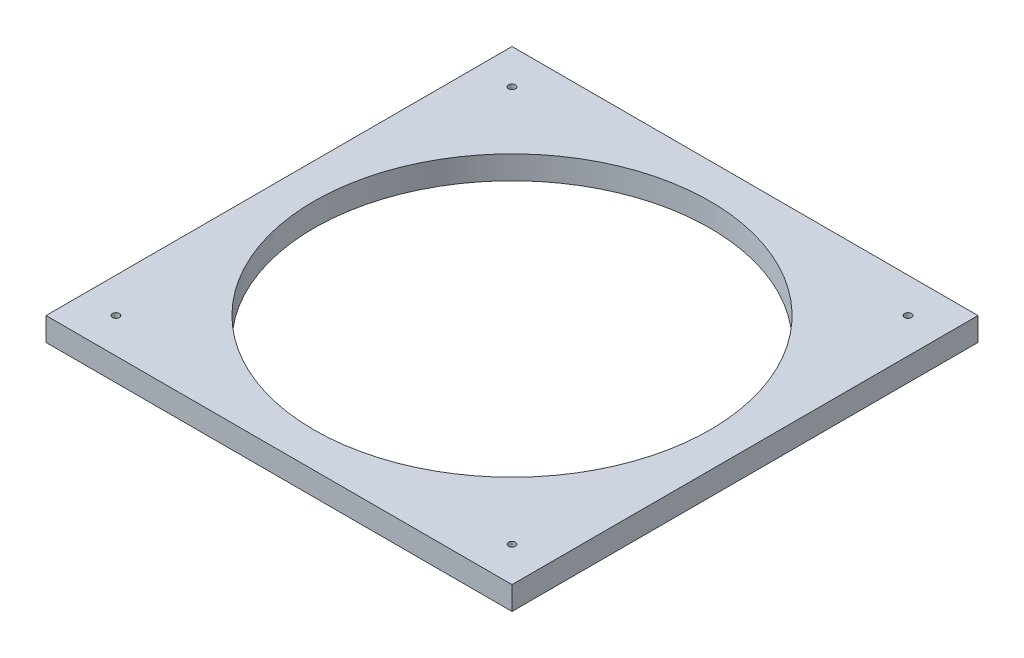
ISO-10303-21;
HEADER;
FILE_DESCRIPTION(('STEP AP214'),'2;1');
FILE_NAME('part.step','',(''),(''),'','','');
FILE_SCHEMA(('AUTOMOTIVE_DESIGN { 1 0 10303 214 1 1 1 1 }'));
ENDSEC;
DATA;
#1=APPLICATION_CONTEXT('core data for automotive mechanical design processes');
#2=APPLICATION_PROTOCOL_DEFINITION('international standard','automotive_design',2000,#1);
#3=PRODUCT_CONTEXT('',#1,'mechanical');
#4=PRODUCT('Part','Part','',(#3));
#5=PRODUCT_RELATED_PRODUCT_CATEGORY('part','',(#4));
#6=PRODUCT_DEFINITION_FORMATION('','',#4);
#7=PRODUCT_DEFINITION_CONTEXT('part definition',#1,'design');
#8=PRODUCT_DEFINITION('design','',#6,#7);
#9=PRODUCT_DEFINITION_SHAPE('','',#8);
#10=(LENGTH_UNIT() NAMED_UNIT(*) SI_UNIT(.MILLI.,.METRE.));
#11=(NAMED_UNIT(*) PLANE_ANGLE_UNIT() SI_UNIT($,.RADIAN.));
#12=(NAMED_UNIT(*) SI_UNIT($,.STERADIAN.) SOLID_ANGLE_UNIT());
#13=UNCERTAINTY_MEASURE_WITH_UNIT(LENGTH_MEASURE(1.E-05),#10,'distance_accuracy_value','');
#14=(GEOMETRIC_REPRESENTATION_CONTEXT(3) GLOBAL_UNCERTAINTY_ASSIGNED_CONTEXT((#13)) GLOBAL_UNIT_ASSIGNED_CONTEXT((#10,
#11,#12)) REPRESENTATION_CONTEXT('',''));
#15=CARTESIAN_POINT('',(0.,0.,0.));
#16=DIRECTION('',(0.,0.,1.));
#17=DIRECTION('',(1.,0.,0.));
#18=AXIS2_PLACEMENT_3D('',#15,#16,#17);
#19=CARTESIAN_POINT('',(0.,20.,0.));
#20=DIRECTION('',(0.,1.,0.));
#21=DIRECTION('',(0.,0.,1.));
#22=AXIS2_PLACEMENT_3D('',#19,#20,#21);
#23=PLANE('',#22);
#24=CARTESIAN_POINT('',(170.00000000001,20.,169.99999999999));
#25=DIRECTION('',(0.,1.,0.));
#26=DIRECTION('',(0.,0.,1.));
#27=AXIS2_PLACEMENT_3D('',#24,#25,#26);
#28=CIRCLE('',#27,2.99999999999999);
#29=CARTESIAN_POINT('',(170.00000000001,20.,172.99999999999));
#30=VERTEX_POINT('',#29);
#31=EDGE_CURVE('E127',#30,#30,#28,.T.);
#32=ORIENTED_EDGE('',*,*,#31,.F.);
#33=EDGE_LOOP('',(#32));
#34=FACE_BOUND('',#33,.T.);
#35=CARTESIAN_POINT('',(-170.,20.,-170.));
#36=DIRECTION('',(0.,1.,0.));
#37=DIRECTION('',(0.,0.,1.));
#38=AXIS2_PLACEMENT_3D('',#35,#36,#37);
#39=CIRCLE('',#38,2.99999999999999);
#40=CARTESIAN_POINT('',(-170.,20.,-167.));
#41=VERTEX_POINT('',#40);
#42=EDGE_CURVE('E115',#41,#41,#39,.T.);
#43=ORIENTED_EDGE('',*,*,#42,.F.);
#44=EDGE_LOOP('',(#43));
#45=FACE_BOUND('',#44,.T.);
#46=DIRECTION('',(0.,0.,1.));
#47=VECTOR('',#46,1.);
#48=CARTESIAN_POINT('',(-200.,20.,-200.));
#49=LINE('',#48,#47);
#50=CARTESIAN_POINT('',(-200.,20.,-200.));
#51=VERTEX_POINT('',#50);
#52=CARTESIAN_POINT('',(-200.,20.,200.));
#53=VERTEX_POINT('',#52);
#54=EDGE_CURVE('E85',#51,#53,#49,.T.);
#55=ORIENTED_EDGE('',*,*,#54,.T.);
#56=DIRECTION('',(1.,0.,0.));
#57=VECTOR('',#56,1.);
#58=CARTESIAN_POINT('',(-200.,20.,200.));
#59=LINE('',#58,#57);
#60=CARTESIAN_POINT('',(200.,20.,200.));
#61=VERTEX_POINT('',#60);
#62=EDGE_CURVE('E80',#53,#61,#59,.T.);
#63=ORIENTED_EDGE('',*,*,#62,.T.);
#64=DIRECTION('',(0.,0.,-1.));
#65=VECTOR('',#64,1.);
#66=CARTESIAN_POINT('',(200.,20.,-200.));
#67=LINE('',#66,#65);
#68=CARTESIAN_POINT('',(200.,20.,-200.));
#69=VERTEX_POINT('',#68);
#70=EDGE_CURVE('E83',#61,#69,#67,.T.);
#71=ORIENTED_EDGE('',*,*,#70,.T.);
#72=DIRECTION('',(-1.,0.,0.));
#73=VECTOR('',#72,1.);
#74=CARTESIAN_POINT('',(-200.,20.,-200.));
#75=LINE('',#74,#73);
#76=EDGE_CURVE('E50',#69,#51,#75,.T.);
#77=ORIENTED_EDGE('',*,*,#76,.T.);
#78=EDGE_LOOP('',(#55,#63,#71,#77));
#79=FACE_BOUND('',#78,.T.);
#80=CARTESIAN_POINT('',(0.,20.,0.));
#81=DIRECTION('',(0.,1.,0.));
#82=DIRECTION('',(0.,0.,1.));
#83=AXIS2_PLACEMENT_3D('',#80,#81,#82);
#84=CIRCLE('',#83,170.);
#85=CARTESIAN_POINT('',(0.,20.,170.));
#86=VERTEX_POINT('',#85);
#87=EDGE_CURVE('E100',#86,#86,#84,.T.);
#88=ORIENTED_EDGE('',*,*,#87,.F.);
#89=EDGE_LOOP('',(#88));
#90=FACE_BOUND('',#89,.T.);
#91=CARTESIAN_POINT('',(170.,20.,-170.00000000001));
#92=DIRECTION('',(0.,1.,0.));
#93=DIRECTION('',(0.,0.,1.));
#94=AXIS2_PLACEMENT_3D('',#91,#92,#93);
#95=CIRCLE('',#94,2.99999999999999);
#96=CARTESIAN_POINT('',(170.,20.,-167.00000000001));
#97=VERTEX_POINT('',#96);
#98=EDGE_CURVE('E121',#97,#97,#95,.T.);
#99=ORIENTED_EDGE('',*,*,#98,.F.);
#100=EDGE_LOOP('',(#99));
#101=FACE_BOUND('',#100,.T.);
#102=CARTESIAN_POINT('',(-169.99999999999,20.,170.));
#103=DIRECTION('',(0.,1.,0.));
#104=DIRECTION('',(0.,0.,1.));
#105=AXIS2_PLACEMENT_3D('',#102,#103,#104);
#106=CIRCLE('',#105,2.99999999999999);
#107=CARTESIAN_POINT('',(-169.99999999999,20.,173.));
#108=VERTEX_POINT('',#107);
#109=EDGE_CURVE('E133',#108,#108,#106,.T.);
#110=ORIENTED_EDGE('',*,*,#109,.F.);
#111=EDGE_LOOP('',(#110));
#112=FACE_BOUND('',#111,.T.);
#113=ADVANCED_FACE('F33',(#34,#45,#79,#90,#101,#112),#23,.T.);
#114=CARTESIAN_POINT('',(0.,0.,0.));
#115=DIRECTION('',(0.,1.,0.));
#116=DIRECTION('',(0.,0.,1.));
#117=AXIS2_PLACEMENT_3D('',#114,#115,#116);
#118=PLANE('',#117);
#119=DIRECTION('',(0.,0.,1.));
#120=VECTOR('',#119,1.);
#121=CARTESIAN_POINT('',(-200.,0.,-200.));
#122=LINE('',#121,#120);
#123=CARTESIAN_POINT('',(-200.,0.,-200.));
#124=VERTEX_POINT('',#123);
#125=CARTESIAN_POINT('',(-200.,0.,200.));
#126=VERTEX_POINT('',#125);
#127=EDGE_CURVE('E97',#124,#126,#122,.T.);
#128=ORIENTED_EDGE('',*,*,#127,.F.);
#129=DIRECTION('',(-1.,0.,0.));
#130=VECTOR('',#129,1.);
#131=CARTESIAN_POINT('',(-200.,0.,-200.));
#132=LINE('',#131,#130);
#133=CARTESIAN_POINT('',(200.,0.,-200.));
#134=VERTEX_POINT('',#133);
#135=EDGE_CURVE('E73',#134,#124,#132,.T.);
#136=ORIENTED_EDGE('',*,*,#135,.F.);
#137=DIRECTION('',(0.,0.,-1.));
#138=VECTOR('',#137,1.);
#139=CARTESIAN_POINT('',(200.,0.,-200.));
#140=LINE('',#139,#138);
#141=CARTESIAN_POINT('',(200.,0.,200.));
#142=VERTEX_POINT('',#141);
#143=EDGE_CURVE('E67',#142,#134,#140,.T.);
#144=ORIENTED_EDGE('',*,*,#143,.F.);
#145=DIRECTION('',(1.,0.,0.));
#146=VECTOR('',#145,1.);
#147=CARTESIAN_POINT('',(-200.,0.,200.));
#148=LINE('',#147,#146);
#149=EDGE_CURVE('E89',#126,#142,#148,.T.);
#150=ORIENTED_EDGE('',*,*,#149,.F.);
#151=EDGE_LOOP('',(#128,#136,#144,#150));
#152=FACE_BOUND('',#151,.T.);
#153=CARTESIAN_POINT('',(0.,0.,0.));
#154=DIRECTION('',(0.,1.,0.));
#155=DIRECTION('',(0.,0.,1.));
#156=AXIS2_PLACEMENT_3D('',#153,#154,#155);
#157=CIRCLE('',#156,170.);
#158=CARTESIAN_POINT('',(0.,0.,170.));
#159=VERTEX_POINT('',#158);
#160=EDGE_CURVE('E112',#159,#159,#157,.T.);
#161=ORIENTED_EDGE('',*,*,#160,.T.);
#162=EDGE_LOOP('',(#161));
#163=FACE_BOUND('',#162,.T.);
#164=CARTESIAN_POINT('',(-170.,0.,-170.));
#165=DIRECTION('',(0.,1.,0.));
#166=DIRECTION('',(0.,0.,1.));
#167=AXIS2_PLACEMENT_3D('',#164,#165,#166);
#168=CIRCLE('',#167,2.99999999999999);
#169=CARTESIAN_POINT('',(-170.,0.,-167.));
#170=VERTEX_POINT('',#169);
#171=EDGE_CURVE('E118',#170,#170,#168,.T.);
#172=ORIENTED_EDGE('',*,*,#171,.T.);
#173=EDGE_LOOP('',(#172));
#174=FACE_BOUND('',#173,.T.);
#175=CARTESIAN_POINT('',(170.,0.,-170.00000000001));
#176=DIRECTION('',(0.,1.,0.));
#177=DIRECTION('',(0.,0.,1.));
#178=AXIS2_PLACEMENT_3D('',#175,#176,#177);
#179=CIRCLE('',#178,2.99999999999999);
#180=CARTESIAN_POINT('',(170.,0.,-167.00000000001));
#181=VERTEX_POINT('',#180);
#182=EDGE_CURVE('E124',#181,#181,#179,.T.);
#183=ORIENTED_EDGE('',*,*,#182,.T.);
#184=EDGE_LOOP('',(#183));
#185=FACE_BOUND('',#184,.T.);
#186=CARTESIAN_POINT('',(170.00000000001,0.,169.99999999999));
#187=DIRECTION('',(0.,1.,0.));
#188=DIRECTION('',(0.,0.,1.));
#189=AXIS2_PLACEMENT_3D('',#186,#187,#188);
#190=CIRCLE('',#189,2.99999999999999);
#191=CARTESIAN_POINT('',(170.00000000001,0.,172.99999999999));
#192=VERTEX_POINT('',#191);
#193=EDGE_CURVE('E130',#192,#192,#190,.T.);
#194=ORIENTED_EDGE('',*,*,#193,.T.);
#195=EDGE_LOOP('',(#194));
#196=FACE_BOUND('',#195,.T.);
#197=CARTESIAN_POINT('',(-169.99999999999,0.,170.));
#198=DIRECTION('',(0.,1.,0.));
#199=DIRECTION('',(0.,0.,1.));
#200=AXIS2_PLACEMENT_3D('',#197,#198,#199);
#201=CIRCLE('',#200,2.99999999999999);
#202=CARTESIAN_POINT('',(-169.99999999999,0.,173.));
#203=VERTEX_POINT('',#202);
#204=EDGE_CURVE('E136',#203,#203,#201,.T.);
#205=ORIENTED_EDGE('',*,*,#204,.T.);
#206=EDGE_LOOP('',(#205));
#207=FACE_BOUND('',#206,.T.);
#208=ADVANCED_FACE('F108',(#152,#163,#174,#185,#196,#207),#118,.F.);
#209=CARTESIAN_POINT('',(-200.,20.,-200.));
#210=DIRECTION('',(1.,0.,0.));
#211=DIRECTION('',(0.,0.,-1.));
#212=AXIS2_PLACEMENT_3D('',#209,#210,#211);
#213=PLANE('',#212);
#214=ORIENTED_EDGE('',*,*,#127,.T.);
#215=DIRECTION('',(0.,-1.,0.));
#216=VECTOR('',#215,1.);
#217=CARTESIAN_POINT('',(-200.,20.,200.));
#218=LINE('',#217,#216);
#219=EDGE_CURVE('E11',#53,#126,#218,.T.);
#220=ORIENTED_EDGE('',*,*,#219,.F.);
#221=ORIENTED_EDGE('',*,*,#54,.F.);
#222=DIRECTION('',(0.,-1.,0.));
#223=VECTOR('',#222,1.);
#224=CARTESIAN_POINT('',(-200.,20.,-200.));
#225=LINE('',#224,#223);
#226=EDGE_CURVE('E93',#51,#124,#225,.T.);
#227=ORIENTED_EDGE('',*,*,#226,.T.);
#228=EDGE_LOOP('',(#214,#220,#221,#227));
#229=FACE_BOUND('',#228,.T.);
#230=ADVANCED_FACE('F35',(#229),#213,.F.);
#231=CARTESIAN_POINT('',(-200.,20.,200.));
#232=DIRECTION('',(0.,0.,-1.));
#233=DIRECTION('',(-1.,0.,0.));
#234=AXIS2_PLACEMENT_3D('',#231,#232,#233);
#235=PLANE('',#234);
#236=ORIENTED_EDGE('',*,*,#149,.T.);
#237=DIRECTION('',(0.,-1.,0.));
#238=VECTOR('',#237,1.);
#239=CARTESIAN_POINT('',(200.,20.,200.));
#240=LINE('',#239,#238);
#241=EDGE_CURVE('E42',#61,#142,#240,.T.);
#242=ORIENTED_EDGE('',*,*,#241,.F.);
#243=ORIENTED_EDGE('',*,*,#62,.F.);
#244=ORIENTED_EDGE('',*,*,#219,.T.);
#245=EDGE_LOOP('',(#236,#242,#243,#244));
#246=FACE_BOUND('',#245,.T.);
#247=ADVANCED_FACE('F88',(#246),#235,.F.);
#248=CARTESIAN_POINT('',(200.,20.,-200.));
#249=DIRECTION('',(-1.,0.,0.));
#250=DIRECTION('',(0.,0.,1.));
#251=AXIS2_PLACEMENT_3D('',#248,#249,#250);
#252=PLANE('',#251);
#253=ORIENTED_EDGE('',*,*,#143,.T.);
#254=DIRECTION('',(0.,-1.,0.));
#255=VECTOR('',#254,1.);
#256=CARTESIAN_POINT('',(200.,20.,-200.));
#257=LINE('',#256,#255);
#258=EDGE_CURVE('E90',#69,#134,#257,.T.);
#259=ORIENTED_EDGE('',*,*,#258,.F.);
#260=ORIENTED_EDGE('',*,*,#70,.F.);
#261=ORIENTED_EDGE('',*,*,#241,.T.);
#262=EDGE_LOOP('',(#253,#259,#260,#261));
#263=FACE_BOUND('',#262,.T.);
#264=ADVANCED_FACE('F91',(#263),#252,.F.);
#265=CARTESIAN_POINT('',(-200.,20.,-200.));
#266=DIRECTION('',(0.,0.,1.));
#267=DIRECTION('',(1.,0.,0.));
#268=AXIS2_PLACEMENT_3D('',#265,#266,#267);
#269=PLANE('',#268);
#270=ORIENTED_EDGE('',*,*,#135,.T.);
#271=ORIENTED_EDGE('',*,*,#226,.F.);
#272=ORIENTED_EDGE('',*,*,#76,.F.);
#273=ORIENTED_EDGE('',*,*,#258,.T.);
#274=EDGE_LOOP('',(#270,#271,#272,#273));
#275=FACE_BOUND('',#274,.T.);
#276=ADVANCED_FACE('F105',(#275),#269,.F.);
#277=CARTESIAN_POINT('',(0.,20.,0.));
#278=DIRECTION('',(0.,-1.,0.));
#279=DIRECTION('',(0.,0.,-1.));
#280=AXIS2_PLACEMENT_3D('',#277,#278,#279);
#281=CYLINDRICAL_SURFACE('',#280,170.);
#282=ORIENTED_EDGE('',*,*,#87,.T.);
#283=EDGE_LOOP('',(#282));
#284=FACE_BOUND('',#283,.T.);
#285=ORIENTED_EDGE('',*,*,#160,.F.);
#286=EDGE_LOOP('',(#285));
#287=FACE_BOUND('',#286,.T.);
#288=ADVANCED_FACE('F155',(#284,#287),#281,.F.);
#289=CARTESIAN_POINT('',(-170.,20.,-170.));
#290=DIRECTION('',(0.,-1.,0.));
#291=DIRECTION('',(0.,0.,-1.));
#292=AXIS2_PLACEMENT_3D('',#289,#290,#291);
#293=CYLINDRICAL_SURFACE('',#292,2.99999999999999);
#294=ORIENTED_EDGE('',*,*,#42,.T.);
#295=EDGE_LOOP('',(#294));
#296=FACE_BOUND('',#295,.T.);
#297=ORIENTED_EDGE('',*,*,#171,.F.);
#298=EDGE_LOOP('',(#297));
#299=FACE_BOUND('',#298,.T.);
#300=ADVANCED_FACE('F201',(#296,#299),#293,.F.);
#301=CARTESIAN_POINT('',(170.,20.,-170.00000000001));
#302=DIRECTION('',(0.,-1.,0.));
#303=DIRECTION('',(0.,0.,-1.));
#304=AXIS2_PLACEMENT_3D('',#301,#302,#303);
#305=CYLINDRICAL_SURFACE('',#304,2.99999999999999);
#306=ORIENTED_EDGE('',*,*,#98,.T.);
#307=EDGE_LOOP('',(#306));
#308=FACE_BOUND('',#307,.T.);
#309=ORIENTED_EDGE('',*,*,#182,.F.);
#310=EDGE_LOOP('',(#309));
#311=FACE_BOUND('',#310,.T.);
#312=ADVANCED_FACE('F209',(#308,#311),#305,.F.);
#313=CARTESIAN_POINT('',(170.00000000001,20.,169.99999999999));
#314=DIRECTION('',(0.,-1.,0.));
#315=DIRECTION('',(0.,0.,-1.));
#316=AXIS2_PLACEMENT_3D('',#313,#314,#315);
#317=CYLINDRICAL_SURFACE('',#316,2.99999999999999);
#318=ORIENTED_EDGE('',*,*,#31,.T.);
#319=EDGE_LOOP('',(#318));
#320=FACE_BOUND('',#319,.T.);
#321=ORIENTED_EDGE('',*,*,#193,.F.);
#322=EDGE_LOOP('',(#321));
#323=FACE_BOUND('',#322,.T.);
#324=ADVANCED_FACE('F217',(#320,#323),#317,.F.);
#325=CARTESIAN_POINT('',(-169.99999999999,20.,170.));
#326=DIRECTION('',(0.,-1.,0.));
#327=DIRECTION('',(0.,0.,-1.));
#328=AXIS2_PLACEMENT_3D('',#325,#326,#327);
#329=CYLINDRICAL_SURFACE('',#328,2.99999999999999);
#330=ORIENTED_EDGE('',*,*,#109,.T.);
#331=EDGE_LOOP('',(#330));
#332=FACE_BOUND('',#331,.T.);
#333=ORIENTED_EDGE('',*,*,#204,.F.);
#334=EDGE_LOOP('',(#333));
#335=FACE_BOUND('',#334,.T.);
#336=ADVANCED_FACE('F142',(#332,#335),#329,.F.);
#337=CLOSED_SHELL('',(#113,#208,#230,#247,#264,#276,#288,#300,#312,#324,#336));
#338=MANIFOLD_SOLID_BREP('B2',#337);
#339=ADVANCED_BREP_SHAPE_REPRESENTATION('',(#18,#338),#14);
#340=SHAPE_DEFINITION_REPRESENTATION(#9,#339);
ENDSEC;
END-ISO-10303-21;
